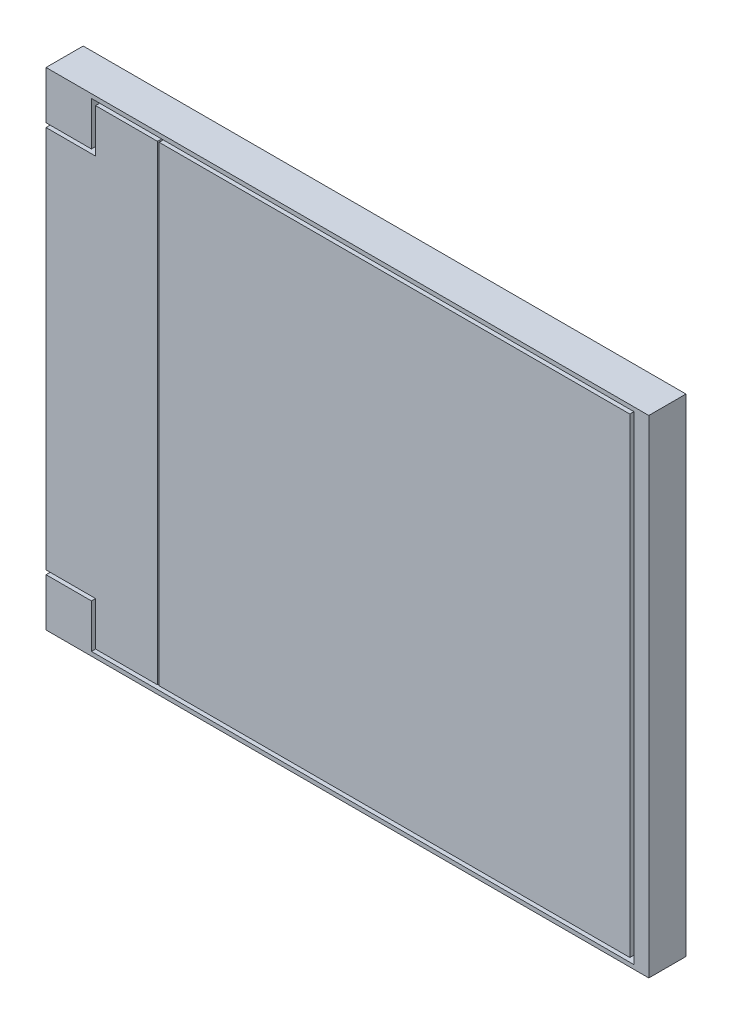
ISO-10303-21;
HEADER;
FILE_DESCRIPTION(('STEP AP214'),'2;1');
FILE_NAME('part.step','',(''),(''),'','','');
FILE_SCHEMA(('AUTOMOTIVE_DESIGN { 1 0 10303 214 1 1 1 1 }'));
ENDSEC;
DATA;
#1=APPLICATION_CONTEXT('core data for automotive mechanical design processes');
#2=APPLICATION_PROTOCOL_DEFINITION('international standard','automotive_design',2000,#1);
#3=PRODUCT_CONTEXT('',#1,'mechanical');
#4=PRODUCT('Part','Part','',(#3));
#5=PRODUCT_RELATED_PRODUCT_CATEGORY('part','',(#4));
#6=PRODUCT_DEFINITION_FORMATION('','',#4);
#7=PRODUCT_DEFINITION_CONTEXT('part definition',#1,'design');
#8=PRODUCT_DEFINITION('design','',#6,#7);
#9=PRODUCT_DEFINITION_SHAPE('','',#8);
#10=(LENGTH_UNIT() NAMED_UNIT(*) SI_UNIT(.MILLI.,.METRE.));
#11=(NAMED_UNIT(*) PLANE_ANGLE_UNIT() SI_UNIT($,.RADIAN.));
#12=(NAMED_UNIT(*) SI_UNIT($,.STERADIAN.) SOLID_ANGLE_UNIT());
#13=UNCERTAINTY_MEASURE_WITH_UNIT(LENGTH_MEASURE(1.E-05),#10,'distance_accuracy_value','');
#14=(GEOMETRIC_REPRESENTATION_CONTEXT(3) GLOBAL_UNCERTAINTY_ASSIGNED_CONTEXT((#13)) GLOBAL_UNIT_ASSIGNED_CONTEXT((#10,
#11,#12)) REPRESENTATION_CONTEXT('',''));
#15=CARTESIAN_POINT('',(0.,0.,0.));
#16=DIRECTION('',(0.,0.,1.));
#17=DIRECTION('',(1.,0.,0.));
#18=AXIS2_PLACEMENT_3D('',#15,#16,#17);
#19=CARTESIAN_POINT('',(35.6,0.,2.25));
#20=DIRECTION('',(-1.,0.,0.));
#21=DIRECTION('',(0.,0.,1.));
#22=AXIS2_PLACEMENT_3D('',#19,#20,#21);
#23=PLANE('',#22);
#24=DIRECTION('',(0.,1.,0.));
#25=VECTOR('',#24,1.);
#26=CARTESIAN_POINT('',(35.6,0.,0.1));
#27=LINE('',#26,#25);
#28=CARTESIAN_POINT('',(35.6,0.25,0.0999999999999998));
#29=VERTEX_POINT('',#28);
#30=CARTESIAN_POINT('',(35.6,29.25,0.0999999999999998));
#31=VERTEX_POINT('',#30);
#32=EDGE_CURVE('E477',#29,#31,#27,.T.);
#33=ORIENTED_EDGE('',*,*,#32,.F.);
#34=DIRECTION('',(0.,0.,-1.));
#35=VECTOR('',#34,1.);
#36=CARTESIAN_POINT('',(35.6,0.25,2.25));
#37=LINE('',#36,#35);
#38=CARTESIAN_POINT('',(35.6,0.25,2.25));
#39=VERTEX_POINT('',#38);
#40=EDGE_CURVE('E11',#39,#29,#37,.T.);
#41=ORIENTED_EDGE('',*,*,#40,.F.);
#42=DIRECTION('',(0.,1.,0.));
#43=VECTOR('',#42,1.);
#44=CARTESIAN_POINT('',(35.6,0.,2.25));
#45=LINE('',#44,#43);
#46=CARTESIAN_POINT('',(35.6,29.25,2.25));
#47=VERTEX_POINT('',#46);
#48=EDGE_CURVE('E499',#39,#47,#45,.T.);
#49=ORIENTED_EDGE('',*,*,#48,.T.);
#50=DIRECTION('',(0.,0.,-1.));
#51=VECTOR('',#50,1.);
#52=CARTESIAN_POINT('',(35.6,29.25,2.25));
#53=LINE('',#52,#51);
#54=EDGE_CURVE('E536',#47,#31,#53,.T.);
#55=ORIENTED_EDGE('',*,*,#54,.T.);
#56=EDGE_LOOP('',(#33,#41,#49,#55));
#57=FACE_BOUND('',#56,.T.);
#58=ADVANCED_FACE('F43',(#57),#23,.T.);
#59=CARTESIAN_POINT('',(0.,0.25,2.25));
#60=DIRECTION('',(0.,1.,0.));
#61=DIRECTION('',(0.,0.,1.));
#62=AXIS2_PLACEMENT_3D('',#59,#60,#61);
#63=PLANE('',#62);
#64=DIRECTION('',(1.,0.,0.));
#65=VECTOR('',#64,1.);
#66=CARTESIAN_POINT('',(0.,0.25,0.1));
#67=LINE('',#66,#65);
#68=CARTESIAN_POINT('',(2.75,0.25,0.0999999999999998));
#69=VERTEX_POINT('',#68);
#70=EDGE_CURVE('E473',#69,#29,#67,.T.);
#71=ORIENTED_EDGE('',*,*,#70,.F.);
#72=DIRECTION('',(0.,0.,-1.));
#73=VECTOR('',#72,1.);
#74=CARTESIAN_POINT('',(2.75,0.25,2.25));
#75=LINE('',#74,#73);
#76=CARTESIAN_POINT('',(2.75,0.25,2.25));
#77=VERTEX_POINT('',#76);
#78=EDGE_CURVE('E51',#77,#69,#75,.T.);
#79=ORIENTED_EDGE('',*,*,#78,.F.);
#80=DIRECTION('',(1.,0.,0.));
#81=VECTOR('',#80,1.);
#82=CARTESIAN_POINT('',(0.,0.25,2.25));
#83=LINE('',#82,#81);
#84=EDGE_CURVE('E503',#77,#39,#83,.T.);
#85=ORIENTED_EDGE('',*,*,#84,.T.);
#86=ORIENTED_EDGE('',*,*,#40,.T.);
#87=EDGE_LOOP('',(#71,#79,#85,#86));
#88=FACE_BOUND('',#87,.T.);
#89=ADVANCED_FACE('F614',(#88),#63,.T.);
#90=CARTESIAN_POINT('',(2.75,0.,2.25));
#91=DIRECTION('',(-1.,0.,0.));
#92=DIRECTION('',(0.,0.,1.));
#93=AXIS2_PLACEMENT_3D('',#90,#91,#92);
#94=PLANE('',#93);
#95=ORIENTED_EDGE('',*,*,#78,.T.);
#96=DIRECTION('',(0.,1.,0.));
#97=VECTOR('',#96,1.);
#98=CARTESIAN_POINT('',(2.75,0.,0.1));
#99=LINE('',#98,#97);
#100=CARTESIAN_POINT('',(2.75,2.9,0.0999999999999998));
#101=VERTEX_POINT('',#100);
#102=EDGE_CURVE('E488',#69,#101,#99,.T.);
#103=ORIENTED_EDGE('',*,*,#102,.T.);
#104=DIRECTION('',(0.,0.,-1.));
#105=VECTOR('',#104,1.);
#106=CARTESIAN_POINT('',(2.75,2.9,2.25));
#107=LINE('',#106,#105);
#108=CARTESIAN_POINT('',(2.75,2.9,2.25));
#109=VERTEX_POINT('',#108);
#110=EDGE_CURVE('E582',#109,#101,#107,.T.);
#111=ORIENTED_EDGE('',*,*,#110,.F.);
#112=DIRECTION('',(0.,1.,0.));
#113=VECTOR('',#112,1.);
#114=CARTESIAN_POINT('',(2.75,0.,2.25));
#115=LINE('',#114,#113);
#116=EDGE_CURVE('E508',#77,#109,#115,.T.);
#117=ORIENTED_EDGE('',*,*,#116,.F.);
#118=EDGE_LOOP('',(#95,#103,#111,#117));
#119=FACE_BOUND('',#118,.T.);
#120=ADVANCED_FACE('F590',(#119),#94,.F.);
#121=CARTESIAN_POINT('',(0.,2.9,2.25));
#122=DIRECTION('',(0.,1.,0.));
#123=DIRECTION('',(-1.,0.,0.));
#124=AXIS2_PLACEMENT_3D('',#121,#122,#123);
#125=PLANE('',#124);
#126=DIRECTION('',(1.,0.,0.));
#127=VECTOR('',#126,1.);
#128=CARTESIAN_POINT('',(0.,2.9,0.1));
#129=LINE('',#128,#127);
#130=CARTESIAN_POINT('',(0.,2.9,0.0999999999999998));
#131=VERTEX_POINT('',#130);
#132=EDGE_CURVE('E495',#131,#101,#129,.T.);
#133=ORIENTED_EDGE('',*,*,#132,.F.);
#134=DIRECTION('',(0.,0.,-1.));
#135=VECTOR('',#134,1.);
#136=CARTESIAN_POINT('',(0.,2.9,2.25));
#137=LINE('',#136,#135);
#138=CARTESIAN_POINT('',(0.,2.9,2.25));
#139=VERTEX_POINT('',#138);
#140=EDGE_CURVE('E578',#139,#131,#137,.T.);
#141=ORIENTED_EDGE('',*,*,#140,.F.);
#142=DIRECTION('',(1.,0.,0.));
#143=VECTOR('',#142,1.);
#144=CARTESIAN_POINT('',(0.,2.9,2.25));
#145=LINE('',#144,#143);
#146=EDGE_CURVE('E511',#139,#109,#145,.T.);
#147=ORIENTED_EDGE('',*,*,#146,.T.);
#148=ORIENTED_EDGE('',*,*,#110,.T.);
#149=EDGE_LOOP('',(#133,#141,#147,#148));
#150=FACE_BOUND('',#149,.T.);
#151=ADVANCED_FACE('F605',(#150),#125,.T.);
#152=CARTESIAN_POINT('',(0.,0.,2.25));
#153=DIRECTION('',(0.,1.,0.));
#154=DIRECTION('',(0.,0.,1.));
#155=AXIS2_PLACEMENT_3D('',#152,#153,#154);
#156=PLANE('',#155);
#157=DIRECTION('',(1.,0.,0.));
#158=VECTOR('',#157,1.);
#159=CARTESIAN_POINT('',(0.,0.,0.));
#160=LINE('',#159,#158);
#161=CARTESIAN_POINT('',(0.,0.,0.));
#162=VERTEX_POINT('',#161);
#163=CARTESIAN_POINT('',(36.5,0.,0.));
#164=VERTEX_POINT('',#163);
#165=EDGE_CURVE('E540',#162,#164,#160,.T.);
#166=ORIENTED_EDGE('',*,*,#165,.T.);
#167=DIRECTION('',(0.,0.,-1.));
#168=VECTOR('',#167,1.);
#169=CARTESIAN_POINT('',(36.5,0.,2.25));
#170=LINE('',#169,#168);
#171=CARTESIAN_POINT('',(36.5,0.,2.25));
#172=VERTEX_POINT('',#171);
#173=EDGE_CURVE('E570',#172,#164,#170,.T.);
#174=ORIENTED_EDGE('',*,*,#173,.F.);
#175=DIRECTION('',(1.,0.,0.));
#176=VECTOR('',#175,1.);
#177=CARTESIAN_POINT('',(0.,0.,2.25));
#178=LINE('',#177,#176);
#179=CARTESIAN_POINT('',(0.,0.,2.25));
#180=VERTEX_POINT('',#179);
#181=EDGE_CURVE('E519',#180,#172,#178,.T.);
#182=ORIENTED_EDGE('',*,*,#181,.F.);
#183=DIRECTION('',(0.,0.,-1.));
#184=VECTOR('',#183,1.);
#185=CARTESIAN_POINT('',(0.,0.,2.25));
#186=LINE('',#185,#184);
#187=EDGE_CURVE('E574',#180,#162,#186,.T.);
#188=ORIENTED_EDGE('',*,*,#187,.T.);
#189=EDGE_LOOP('',(#166,#174,#182,#188));
#190=FACE_BOUND('',#189,.T.);
#191=ADVANCED_FACE('F685',(#190),#156,.F.);
#192=CARTESIAN_POINT('',(36.5,0.,2.25));
#193=DIRECTION('',(-1.,0.,0.));
#194=DIRECTION('',(0.,0.,1.));
#195=AXIS2_PLACEMENT_3D('',#192,#193,#194);
#196=PLANE('',#195);
#197=DIRECTION('',(0.,1.,0.));
#198=VECTOR('',#197,1.);
#199=CARTESIAN_POINT('',(36.5,0.,0.));
#200=LINE('',#199,#198);
#201=CARTESIAN_POINT('',(36.5,29.5,0.));
#202=VERTEX_POINT('',#201);
#203=EDGE_CURVE('E543',#164,#202,#200,.T.);
#204=ORIENTED_EDGE('',*,*,#203,.T.);
#205=DIRECTION('',(0.,0.,-1.));
#206=VECTOR('',#205,1.);
#207=CARTESIAN_POINT('',(36.5,29.5,2.25));
#208=LINE('',#207,#206);
#209=CARTESIAN_POINT('',(36.5,29.5,2.25));
#210=VERTEX_POINT('',#209);
#211=EDGE_CURVE('E567',#210,#202,#208,.T.);
#212=ORIENTED_EDGE('',*,*,#211,.F.);
#213=DIRECTION('',(0.,1.,0.));
#214=VECTOR('',#213,1.);
#215=CARTESIAN_POINT('',(36.5,0.,2.25));
#216=LINE('',#215,#214);
#217=EDGE_CURVE('E523',#172,#210,#216,.T.);
#218=ORIENTED_EDGE('',*,*,#217,.F.);
#219=ORIENTED_EDGE('',*,*,#173,.T.);
#220=EDGE_LOOP('',(#204,#212,#218,#219));
#221=FACE_BOUND('',#220,.T.);
#222=ADVANCED_FACE('F688',(#221),#196,.F.);
#223=CARTESIAN_POINT('',(0.,29.5,2.25));
#224=DIRECTION('',(0.,1.,0.));
#225=DIRECTION('',(0.,0.,1.));
#226=AXIS2_PLACEMENT_3D('',#223,#224,#225);
#227=PLANE('',#226);
#228=DIRECTION('',(1.,0.,0.));
#229=VECTOR('',#228,1.);
#230=CARTESIAN_POINT('',(0.,29.5,0.));
#231=LINE('',#230,#229);
#232=CARTESIAN_POINT('',(0.,29.5,0.));
#233=VERTEX_POINT('',#232);
#234=EDGE_CURVE('E539',#233,#202,#231,.T.);
#235=ORIENTED_EDGE('',*,*,#234,.F.);
#236=DIRECTION('',(0.,0.,-1.));
#237=VECTOR('',#236,1.);
#238=CARTESIAN_POINT('',(0.,29.5,2.25));
#239=LINE('',#238,#237);
#240=CARTESIAN_POINT('',(0.,29.5,2.25));
#241=VERTEX_POINT('',#240);
#242=EDGE_CURVE('E564',#241,#233,#239,.T.);
#243=ORIENTED_EDGE('',*,*,#242,.F.);
#244=DIRECTION('',(1.,0.,0.));
#245=VECTOR('',#244,1.);
#246=CARTESIAN_POINT('',(0.,29.5,2.25));
#247=LINE('',#246,#245);
#248=EDGE_CURVE('E526',#241,#210,#247,.T.);
#249=ORIENTED_EDGE('',*,*,#248,.T.);
#250=ORIENTED_EDGE('',*,*,#211,.T.);
#251=EDGE_LOOP('',(#235,#243,#249,#250));
#252=FACE_BOUND('',#251,.T.);
#253=ADVANCED_FACE('F692',(#252),#227,.T.);
#254=CARTESIAN_POINT('',(0.,0.,2.25));
#255=DIRECTION('',(1.,0.,0.));
#256=DIRECTION('',(0.,0.,-1.));
#257=AXIS2_PLACEMENT_3D('',#254,#255,#256);
#258=PLANE('',#257);
#259=DIRECTION('',(0.,-1.,0.));
#260=VECTOR('',#259,1.);
#261=CARTESIAN_POINT('',(0.,0.,0.));
#262=LINE('',#261,#260);
#263=EDGE_CURVE('E504',#233,#162,#262,.T.);
#264=ORIENTED_EDGE('',*,*,#263,.T.);
#265=ORIENTED_EDGE('',*,*,#187,.F.);
#266=DIRECTION('',(0.,-1.,0.));
#267=VECTOR('',#266,1.);
#268=CARTESIAN_POINT('',(0.,0.,2.25));
#269=LINE('',#268,#267);
#270=EDGE_CURVE('E516',#139,#180,#269,.T.);
#271=ORIENTED_EDGE('',*,*,#270,.F.);
#272=ORIENTED_EDGE('',*,*,#140,.T.);
#273=DIRECTION('',(0.,-1.,0.));
#274=VECTOR('',#273,1.);
#275=CARTESIAN_POINT('',(0.,0.,0.1));
#276=LINE('',#275,#274);
#277=CARTESIAN_POINT('',(0.,3.15,0.1));
#278=VERTEX_POINT('',#277);
#279=EDGE_CURVE('E491',#278,#131,#276,.T.);
#280=ORIENTED_EDGE('',*,*,#279,.F.);
#281=DIRECTION('',(0.,0.,-1.));
#282=VECTOR('',#281,1.);
#283=CARTESIAN_POINT('',(0.,3.15,42.5550865276332));
#284=LINE('',#283,#282);
#285=CARTESIAN_POINT('',(0.,3.15,2.25));
#286=VERTEX_POINT('',#285);
#287=EDGE_CURVE('E388',#286,#278,#284,.T.);
#288=ORIENTED_EDGE('',*,*,#287,.F.);
#289=DIRECTION('',(0.,-1.,0.));
#290=VECTOR('',#289,1.);
#291=CARTESIAN_POINT('',(0.,0.,2.25));
#292=LINE('',#291,#290);
#293=CARTESIAN_POINT('',(0.,26.35,2.25));
#294=VERTEX_POINT('',#293);
#295=EDGE_CURVE('E345',#294,#286,#292,.T.);
#296=ORIENTED_EDGE('',*,*,#295,.F.);
#297=DIRECTION('',(0.,0.,-1.));
#298=VECTOR('',#297,1.);
#299=CARTESIAN_POINT('',(0.,26.35,42.5550865276332));
#300=LINE('',#299,#298);
#301=CARTESIAN_POINT('',(0.,26.35,0.1));
#302=VERTEX_POINT('',#301);
#303=EDGE_CURVE('E381',#294,#302,#300,.T.);
#304=ORIENTED_EDGE('',*,*,#303,.T.);
#305=CARTESIAN_POINT('',(0.,26.6,0.0999999999999998));
#306=VERTEX_POINT('',#305);
#307=EDGE_CURVE('E492',#306,#302,#276,.T.);
#308=ORIENTED_EDGE('',*,*,#307,.F.);
#309=DIRECTION('',(0.,0.,-1.));
#310=VECTOR('',#309,1.);
#311=CARTESIAN_POINT('',(0.,26.6,2.25));
#312=LINE('',#311,#310);
#313=CARTESIAN_POINT('',(0.,26.6,2.25));
#314=VERTEX_POINT('',#313);
#315=EDGE_CURVE('E561',#314,#306,#312,.T.);
#316=ORIENTED_EDGE('',*,*,#315,.F.);
#317=EDGE_CURVE('E520',#241,#314,#269,.T.);
#318=ORIENTED_EDGE('',*,*,#317,.F.);
#319=ORIENTED_EDGE('',*,*,#242,.T.);
#320=EDGE_LOOP('',(#264,#265,#271,#272,#280,#288,#296,#304,#308,#316,#318,#319));
#321=FACE_BOUND('',#320,.T.);
#322=ADVANCED_FACE('F607',(#321),#258,.F.);
#323=CARTESIAN_POINT('',(0.,26.6,2.25));
#324=DIRECTION('',(0.,1.,0.));
#325=DIRECTION('',(-1.,0.,0.));
#326=AXIS2_PLACEMENT_3D('',#323,#324,#325);
#327=PLANE('',#326);
#328=ORIENTED_EDGE('',*,*,#315,.T.);
#329=DIRECTION('',(1.,0.,0.));
#330=VECTOR('',#329,1.);
#331=CARTESIAN_POINT('',(0.,26.6,0.1));
#332=LINE('',#331,#330);
#333=CARTESIAN_POINT('',(2.75,26.6,0.0999999999999998));
#334=VERTEX_POINT('',#333);
#335=EDGE_CURVE('E487',#306,#334,#332,.T.);
#336=ORIENTED_EDGE('',*,*,#335,.T.);
#337=DIRECTION('',(0.,0.,-1.));
#338=VECTOR('',#337,1.);
#339=CARTESIAN_POINT('',(2.75,26.6,2.25));
#340=LINE('',#339,#338);
#341=CARTESIAN_POINT('',(2.75,26.6,2.25));
#342=VERTEX_POINT('',#341);
#343=EDGE_CURVE('E557',#342,#334,#340,.T.);
#344=ORIENTED_EDGE('',*,*,#343,.F.);
#345=DIRECTION('',(1.,0.,0.));
#346=VECTOR('',#345,1.);
#347=CARTESIAN_POINT('',(0.,26.6,2.25));
#348=LINE('',#347,#346);
#349=EDGE_CURVE('E530',#314,#342,#348,.T.);
#350=ORIENTED_EDGE('',*,*,#349,.F.);
#351=EDGE_LOOP('',(#328,#336,#344,#350));
#352=FACE_BOUND('',#351,.T.);
#353=ADVANCED_FACE('F630',(#352),#327,.F.);
#354=ORIENTED_EDGE('',*,*,#343,.T.);
#355=CARTESIAN_POINT('',(2.75,29.25,0.0999999999999998));
#356=VERTEX_POINT('',#355);
#357=EDGE_CURVE('E484',#334,#356,#99,.T.);
#358=ORIENTED_EDGE('',*,*,#357,.T.);
#359=DIRECTION('',(0.,0.,-1.));
#360=VECTOR('',#359,1.);
#361=CARTESIAN_POINT('',(2.75,29.25,2.25));
#362=LINE('',#361,#360);
#363=CARTESIAN_POINT('',(2.75,29.25,2.25));
#364=VERTEX_POINT('',#363);
#365=EDGE_CURVE('E553',#364,#356,#362,.T.);
#366=ORIENTED_EDGE('',*,*,#365,.F.);
#367=EDGE_CURVE('E512',#342,#364,#115,.T.);
#368=ORIENTED_EDGE('',*,*,#367,.F.);
#369=EDGE_LOOP('',(#354,#358,#366,#368));
#370=FACE_BOUND('',#369,.T.);
#371=ADVANCED_FACE('F626',(#370),#94,.F.);
#372=CARTESIAN_POINT('',(0.,29.25,2.25));
#373=DIRECTION('',(0.,1.,0.));
#374=DIRECTION('',(0.,0.,1.));
#375=AXIS2_PLACEMENT_3D('',#372,#373,#374);
#376=PLANE('',#375);
#377=ORIENTED_EDGE('',*,*,#365,.T.);
#378=DIRECTION('',(1.,0.,0.));
#379=VECTOR('',#378,1.);
#380=CARTESIAN_POINT('',(0.,29.25,0.1));
#381=LINE('',#380,#379);
#382=EDGE_CURVE('E481',#356,#31,#381,.T.);
#383=ORIENTED_EDGE('',*,*,#382,.T.);
#384=ORIENTED_EDGE('',*,*,#54,.F.);
#385=DIRECTION('',(1.,0.,0.));
#386=VECTOR('',#385,1.);
#387=CARTESIAN_POINT('',(0.,29.25,2.25));
#388=LINE('',#387,#386);
#389=EDGE_CURVE('E533',#364,#47,#388,.T.);
#390=ORIENTED_EDGE('',*,*,#389,.F.);
#391=EDGE_LOOP('',(#377,#383,#384,#390));
#392=FACE_BOUND('',#391,.T.);
#393=ADVANCED_FACE('F621',(#392),#376,.F.);
#394=CARTESIAN_POINT('',(0.,0.,2.25));
#395=DIRECTION('',(0.,0.,1.));
#396=DIRECTION('',(1.,0.,0.));
#397=AXIS2_PLACEMENT_3D('',#394,#395,#396);
#398=PLANE('',#397);
#399=ORIENTED_EDGE('',*,*,#48,.F.);
#400=ORIENTED_EDGE('',*,*,#84,.F.);
#401=ORIENTED_EDGE('',*,*,#116,.T.);
#402=ORIENTED_EDGE('',*,*,#146,.F.);
#403=ORIENTED_EDGE('',*,*,#270,.T.);
#404=ORIENTED_EDGE('',*,*,#181,.T.);
#405=ORIENTED_EDGE('',*,*,#217,.T.);
#406=ORIENTED_EDGE('',*,*,#248,.F.);
#407=ORIENTED_EDGE('',*,*,#317,.T.);
#408=ORIENTED_EDGE('',*,*,#349,.T.);
#409=ORIENTED_EDGE('',*,*,#367,.T.);
#410=ORIENTED_EDGE('',*,*,#389,.T.);
#411=EDGE_LOOP('',(#399,#400,#401,#402,#403,#404,#405,#406,#407,#408,#409,#410));
#412=FACE_BOUND('',#411,.T.);
#413=ADVANCED_FACE('F613',(#412),#398,.T.);
#414=CARTESIAN_POINT('',(0.,0.,0.));
#415=DIRECTION('',(0.,0.,1.));
#416=DIRECTION('',(1.,0.,0.));
#417=AXIS2_PLACEMENT_3D('',#414,#415,#416);
#418=PLANE('',#417);
#419=DIRECTION('',(1.,0.,0.));
#420=VECTOR('',#419,1.);
#421=CARTESIAN_POINT('',(0.,20.15,0.));
#422=LINE('',#421,#420);
#423=CARTESIAN_POINT('',(7.3,20.15,0.));
#424=VERTEX_POINT('',#423);
#425=CARTESIAN_POINT('',(8.8,20.15,0.));
#426=VERTEX_POINT('',#425);
#427=EDGE_CURVE('E295',#424,#426,#422,.T.);
#428=ORIENTED_EDGE('',*,*,#427,.F.);
#429=DIRECTION('',(0.,-1.,0.));
#430=VECTOR('',#429,1.);
#431=CARTESIAN_POINT('',(7.3,0.,0.));
#432=LINE('',#431,#430);
#433=CARTESIAN_POINT('',(7.3,19.75,0.));
#434=VERTEX_POINT('',#433);
#435=EDGE_CURVE('E261',#424,#434,#432,.T.);
#436=ORIENTED_EDGE('',*,*,#435,.T.);
#437=DIRECTION('',(1.,0.,0.));
#438=VECTOR('',#437,1.);
#439=CARTESIAN_POINT('',(0.,19.75,0.));
#440=LINE('',#439,#438);
#441=CARTESIAN_POINT('',(8.8,19.75,0.));
#442=VERTEX_POINT('',#441);
#443=EDGE_CURVE('E282',#434,#442,#440,.T.);
#444=ORIENTED_EDGE('',*,*,#443,.T.);
#445=DIRECTION('',(0.,1.,0.));
#446=VECTOR('',#445,1.);
#447=CARTESIAN_POINT('',(8.8,0.,0.));
#448=LINE('',#447,#446);
#449=EDGE_CURVE('E58',#442,#426,#448,.T.);
#450=ORIENTED_EDGE('',*,*,#449,.T.);
#451=EDGE_LOOP('',(#428,#436,#444,#450));
#452=FACE_BOUND('',#451,.T.);
#453=DIRECTION('',(0.,1.,0.));
#454=VECTOR('',#453,1.);
#455=CARTESIAN_POINT('',(7.3,0.,0.));
#456=LINE('',#455,#454);
#457=CARTESIAN_POINT('',(7.3,9.35,0.));
#458=VERTEX_POINT('',#457);
#459=CARTESIAN_POINT('',(7.3,9.75,0.));
#460=VERTEX_POINT('',#459);
#461=EDGE_CURVE('E326',#458,#460,#456,.T.);
#462=ORIENTED_EDGE('',*,*,#461,.F.);
#463=DIRECTION('',(1.,0.,0.));
#464=VECTOR('',#463,1.);
#465=CARTESIAN_POINT('',(0.,9.35,0.));
#466=LINE('',#465,#464);
#467=CARTESIAN_POINT('',(8.8,9.35,0.));
#468=VERTEX_POINT('',#467);
#469=EDGE_CURVE('E266',#458,#468,#466,.T.);
#470=ORIENTED_EDGE('',*,*,#469,.T.);
#471=DIRECTION('',(0.,1.,0.));
#472=VECTOR('',#471,1.);
#473=CARTESIAN_POINT('',(8.8,0.,0.));
#474=LINE('',#473,#472);
#475=CARTESIAN_POINT('',(8.8,9.75,0.));
#476=VERTEX_POINT('',#475);
#477=EDGE_CURVE('E312',#468,#476,#474,.T.);
#478=ORIENTED_EDGE('',*,*,#477,.T.);
#479=DIRECTION('',(1.,0.,0.));
#480=VECTOR('',#479,1.);
#481=CARTESIAN_POINT('',(0.,9.75,0.));
#482=LINE('',#481,#480);
#483=EDGE_CURVE('E66',#460,#476,#482,.T.);
#484=ORIENTED_EDGE('',*,*,#483,.F.);
#485=EDGE_LOOP('',(#462,#470,#478,#484));
#486=FACE_BOUND('',#485,.T.);
#487=ORIENTED_EDGE('',*,*,#165,.F.);
#488=ORIENTED_EDGE('',*,*,#263,.F.);
#489=ORIENTED_EDGE('',*,*,#234,.T.);
#490=ORIENTED_EDGE('',*,*,#203,.F.);
#491=EDGE_LOOP('',(#487,#488,#489,#490));
#492=FACE_BOUND('',#491,.T.);
#493=ADVANCED_FACE('F704',(#452,#486,#492),#418,.F.);
#494=CARTESIAN_POINT('',(0.,0.,0.1));
#495=DIRECTION('',(0.,0.,1.));
#496=DIRECTION('',(1.,0.,0.));
#497=AXIS2_PLACEMENT_3D('',#494,#495,#496);
#498=PLANE('',#497);
#499=DIRECTION('',(-1.,0.,0.));
#500=VECTOR('',#499,1.);
#501=CARTESIAN_POINT('',(0.,3.15,0.1));
#502=LINE('',#501,#500);
#503=CARTESIAN_POINT('',(3.,3.15,0.1));
#504=VERTEX_POINT('',#503);
#505=EDGE_CURVE('E365',#504,#278,#502,.T.);
#506=ORIENTED_EDGE('',*,*,#505,.T.);
#507=ORIENTED_EDGE('',*,*,#279,.T.);
#508=ORIENTED_EDGE('',*,*,#132,.T.);
#509=ORIENTED_EDGE('',*,*,#102,.F.);
#510=ORIENTED_EDGE('',*,*,#70,.T.);
#511=ORIENTED_EDGE('',*,*,#32,.T.);
#512=ORIENTED_EDGE('',*,*,#382,.F.);
#513=ORIENTED_EDGE('',*,*,#357,.F.);
#514=ORIENTED_EDGE('',*,*,#335,.F.);
#515=ORIENTED_EDGE('',*,*,#307,.T.);
#516=DIRECTION('',(1.,0.,0.));
#517=VECTOR('',#516,1.);
#518=CARTESIAN_POINT('',(0.,26.35,0.1));
#519=LINE('',#518,#517);
#520=CARTESIAN_POINT('',(3.,26.35,0.1));
#521=VERTEX_POINT('',#520);
#522=EDGE_CURVE('E350',#302,#521,#519,.T.);
#523=ORIENTED_EDGE('',*,*,#522,.T.);
#524=DIRECTION('',(0.,1.,0.));
#525=VECTOR('',#524,1.);
#526=CARTESIAN_POINT('',(3.,0.,0.1));
#527=LINE('',#526,#525);
#528=CARTESIAN_POINT('',(3.,29.,0.1));
#529=VERTEX_POINT('',#528);
#530=EDGE_CURVE('E346',#521,#529,#527,.T.);
#531=ORIENTED_EDGE('',*,*,#530,.T.);
#532=DIRECTION('',(1.,0.,0.));
#533=VECTOR('',#532,1.);
#534=CARTESIAN_POINT('',(0.,29.,0.1));
#535=LINE('',#534,#533);
#536=CARTESIAN_POINT('',(6.74999999999998,29.,0.1));
#537=VERTEX_POINT('',#536);
#538=EDGE_CURVE('E349',#529,#537,#535,.T.);
#539=ORIENTED_EDGE('',*,*,#538,.T.);
#540=DIRECTION('',(0.,-1.,0.));
#541=VECTOR('',#540,1.);
#542=CARTESIAN_POINT('',(6.74999999999998,0.,0.1));
#543=LINE('',#542,#541);
#544=CARTESIAN_POINT('',(6.74999999999998,0.49999999999999,0.1));
#545=VERTEX_POINT('',#544);
#546=EDGE_CURVE('E353',#537,#545,#543,.T.);
#547=ORIENTED_EDGE('',*,*,#546,.T.);
#548=DIRECTION('',(1.,0.,0.));
#549=VECTOR('',#548,1.);
#550=CARTESIAN_POINT('',(0.,0.49999999999999,0.1));
#551=LINE('',#550,#549);
#552=CARTESIAN_POINT('',(3.,0.49999999999999,0.1));
#553=VERTEX_POINT('',#552);
#554=EDGE_CURVE('E357',#553,#545,#551,.T.);
#555=ORIENTED_EDGE('',*,*,#554,.F.);
#556=DIRECTION('',(0.,1.,0.));
#557=VECTOR('',#556,1.);
#558=CARTESIAN_POINT('',(3.,0.,0.1));
#559=LINE('',#558,#557);
#560=EDGE_CURVE('E356',#553,#504,#559,.T.);
#561=ORIENTED_EDGE('',*,*,#560,.T.);
#562=EDGE_LOOP('',(#506,#507,#508,#509,#510,#511,#512,#513,#514,#515,#523,#531,#539,#547,#555,#561));
#563=FACE_BOUND('',#562,.T.);
#564=DIRECTION('',(0.,-1.,0.));
#565=VECTOR('',#564,1.);
#566=CARTESIAN_POINT('',(35.35,0.,0.1));
#567=LINE('',#566,#565);
#568=CARTESIAN_POINT('',(35.35,29.,0.1));
#569=VERTEX_POINT('',#568);
#570=CARTESIAN_POINT('',(35.35,0.499999999999994,0.1));
#571=VERTEX_POINT('',#570);
#572=EDGE_CURVE('E430',#569,#571,#567,.T.);
#573=ORIENTED_EDGE('',*,*,#572,.T.);
#574=DIRECTION('',(-1.,0.,0.));
#575=VECTOR('',#574,1.);
#576=CARTESIAN_POINT('',(0.,0.499999999999989,0.1));
#577=LINE('',#576,#575);
#578=CARTESIAN_POINT('',(6.84999999999998,0.49999999999999,0.1));
#579=VERTEX_POINT('',#578);
#580=EDGE_CURVE('E433',#571,#579,#577,.T.);
#581=ORIENTED_EDGE('',*,*,#580,.T.);
#582=DIRECTION('',(0.,1.,0.));
#583=VECTOR('',#582,1.);
#584=CARTESIAN_POINT('',(6.84999999999998,0.,0.1));
#585=LINE('',#584,#583);
#586=CARTESIAN_POINT('',(6.84999999999998,29.,0.1));
#587=VERTEX_POINT('',#586);
#588=EDGE_CURVE('E436',#579,#587,#585,.T.);
#589=ORIENTED_EDGE('',*,*,#588,.T.);
#590=DIRECTION('',(1.,0.,0.));
#591=VECTOR('',#590,1.);
#592=CARTESIAN_POINT('',(0.,29.,0.1));
#593=LINE('',#592,#591);
#594=EDGE_CURVE('E429',#587,#569,#593,.T.);
#595=ORIENTED_EDGE('',*,*,#594,.T.);
#596=EDGE_LOOP('',(#573,#581,#589,#595));
#597=FACE_BOUND('',#596,.T.);
#598=ADVANCED_FACE('F595',(#563,#597),#498,.T.);
#599=CARTESIAN_POINT('',(0.,0.,2.25));
#600=DIRECTION('',(0.,0.,1.));
#601=DIRECTION('',(1.,0.,0.));
#602=AXIS2_PLACEMENT_3D('',#599,#600,#601);
#603=PLANE('',#602);
#604=DIRECTION('',(1.,0.,0.));
#605=VECTOR('',#604,1.);
#606=CARTESIAN_POINT('',(0.,29.,2.25));
#607=LINE('',#606,#605);
#608=CARTESIAN_POINT('',(6.84999999999998,29.,2.25));
#609=VERTEX_POINT('',#608);
#610=CARTESIAN_POINT('',(35.35,29.,2.25));
#611=VERTEX_POINT('',#610);
#612=EDGE_CURVE('E446',#609,#611,#607,.T.);
#613=ORIENTED_EDGE('',*,*,#612,.F.);
#614=DIRECTION('',(0.,1.,0.));
#615=VECTOR('',#614,1.);
#616=CARTESIAN_POINT('',(6.84999999999998,0.,2.25));
#617=LINE('',#616,#615);
#618=CARTESIAN_POINT('',(6.84999999999998,0.49999999999999,2.25));
#619=VERTEX_POINT('',#618);
#620=EDGE_CURVE('E452',#619,#609,#617,.T.);
#621=ORIENTED_EDGE('',*,*,#620,.F.);
#622=DIRECTION('',(-1.,0.,0.));
#623=VECTOR('',#622,1.);
#624=CARTESIAN_POINT('',(0.,0.499999999999989,2.25));
#625=LINE('',#624,#623);
#626=CARTESIAN_POINT('',(35.35,0.499999999999994,2.25));
#627=VERTEX_POINT('',#626);
#628=EDGE_CURVE('E457',#627,#619,#625,.T.);
#629=ORIENTED_EDGE('',*,*,#628,.F.);
#630=DIRECTION('',(0.,-1.,0.));
#631=VECTOR('',#630,1.);
#632=CARTESIAN_POINT('',(35.35,0.,2.25));
#633=LINE('',#632,#631);
#634=EDGE_CURVE('E439',#611,#627,#633,.T.);
#635=ORIENTED_EDGE('',*,*,#634,.F.);
#636=EDGE_LOOP('',(#613,#621,#629,#635));
#637=FACE_BOUND('',#636,.T.);
#638=ADVANCED_FACE('F712',(#637),#603,.T.);
#639=CARTESIAN_POINT('',(35.35,0.,42.5550865276332));
#640=DIRECTION('',(1.,0.,0.));
#641=DIRECTION('',(0.,1.,0.));
#642=AXIS2_PLACEMENT_3D('',#639,#640,#641);
#643=PLANE('',#642);
#644=DIRECTION('',(0.,0.,-1.));
#645=VECTOR('',#644,1.);
#646=CARTESIAN_POINT('',(35.35,29.,42.5550865276332));
#647=LINE('',#646,#645);
#648=EDGE_CURVE('E450',#611,#569,#647,.T.);
#649=ORIENTED_EDGE('',*,*,#648,.F.);
#650=ORIENTED_EDGE('',*,*,#634,.T.);
#651=DIRECTION('',(0.,0.,-1.));
#652=VECTOR('',#651,1.);
#653=CARTESIAN_POINT('',(35.35,0.499999999999994,42.5550865276332));
#654=LINE('',#653,#652);
#655=EDGE_CURVE('E445',#627,#571,#654,.T.);
#656=ORIENTED_EDGE('',*,*,#655,.T.);
#657=ORIENTED_EDGE('',*,*,#572,.F.);
#658=EDGE_LOOP('',(#649,#650,#656,#657));
#659=FACE_BOUND('',#658,.T.);
#660=ADVANCED_FACE('F715',(#659),#643,.T.);
#661=CARTESIAN_POINT('',(0.,0.499999999999989,42.5550865276332));
#662=DIRECTION('',(0.,-1.,0.));
#663=DIRECTION('',(1.,0.,0.));
#664=AXIS2_PLACEMENT_3D('',#661,#662,#663);
#665=PLANE('',#664);
#666=ORIENTED_EDGE('',*,*,#655,.F.);
#667=ORIENTED_EDGE('',*,*,#628,.T.);
#668=DIRECTION('',(0.,0.,-1.));
#669=VECTOR('',#668,1.);
#670=CARTESIAN_POINT('',(6.84999999999998,0.49999999999999,42.5550865276332));
#671=LINE('',#670,#669);
#672=EDGE_CURVE('E456',#619,#579,#671,.T.);
#673=ORIENTED_EDGE('',*,*,#672,.T.);
#674=ORIENTED_EDGE('',*,*,#580,.F.);
#675=EDGE_LOOP('',(#666,#667,#673,#674));
#676=FACE_BOUND('',#675,.T.);
#677=ADVANCED_FACE('F719',(#676),#665,.T.);
#678=CARTESIAN_POINT('',(6.84999999999998,0.,42.5550865276332));
#679=DIRECTION('',(-1.,0.,0.));
#680=DIRECTION('',(0.,0.,1.));
#681=AXIS2_PLACEMENT_3D('',#678,#679,#680);
#682=PLANE('',#681);
#683=ORIENTED_EDGE('',*,*,#672,.F.);
#684=ORIENTED_EDGE('',*,*,#620,.T.);
#685=DIRECTION('',(0.,0.,-1.));
#686=VECTOR('',#685,1.);
#687=CARTESIAN_POINT('',(6.84999999999998,29.,42.5550865276332));
#688=LINE('',#687,#686);
#689=EDGE_CURVE('E451',#609,#587,#688,.T.);
#690=ORIENTED_EDGE('',*,*,#689,.T.);
#691=ORIENTED_EDGE('',*,*,#588,.F.);
#692=EDGE_LOOP('',(#683,#684,#690,#691));
#693=FACE_BOUND('',#692,.T.);
#694=ADVANCED_FACE('F671',(#693),#682,.T.);
#695=CARTESIAN_POINT('',(0.,29.,42.5550865276332));
#696=DIRECTION('',(0.,1.,0.));
#697=DIRECTION('',(0.,0.,1.));
#698=AXIS2_PLACEMENT_3D('',#695,#696,#697);
#699=PLANE('',#698);
#700=ORIENTED_EDGE('',*,*,#689,.F.);
#701=ORIENTED_EDGE('',*,*,#612,.T.);
#702=ORIENTED_EDGE('',*,*,#648,.T.);
#703=ORIENTED_EDGE('',*,*,#594,.F.);
#704=EDGE_LOOP('',(#700,#701,#702,#703));
#705=FACE_BOUND('',#704,.T.);
#706=ADVANCED_FACE('F664',(#705),#699,.T.);
#707=CARTESIAN_POINT('',(0.,0.,2.25));
#708=DIRECTION('',(0.,0.,1.));
#709=DIRECTION('',(1.,0.,0.));
#710=AXIS2_PLACEMENT_3D('',#707,#708,#709);
#711=PLANE('',#710);
#712=DIRECTION('',(1.,0.,0.));
#713=VECTOR('',#712,1.);
#714=CARTESIAN_POINT('',(0.,26.35,2.25));
#715=LINE('',#714,#713);
#716=CARTESIAN_POINT('',(3.,26.35,2.25));
#717=VERTEX_POINT('',#716);
#718=EDGE_CURVE('E376',#294,#717,#715,.T.);
#719=ORIENTED_EDGE('',*,*,#718,.F.);
#720=ORIENTED_EDGE('',*,*,#295,.T.);
#721=DIRECTION('',(-1.,0.,0.));
#722=VECTOR('',#721,1.);
#723=CARTESIAN_POINT('',(0.,3.15,2.25));
#724=LINE('',#723,#722);
#725=CARTESIAN_POINT('',(3.,3.15,2.25));
#726=VERTEX_POINT('',#725);
#727=EDGE_CURVE('E384',#726,#286,#724,.T.);
#728=ORIENTED_EDGE('',*,*,#727,.F.);
#729=DIRECTION('',(0.,1.,0.));
#730=VECTOR('',#729,1.);
#731=CARTESIAN_POINT('',(3.,0.,2.25));
#732=LINE('',#731,#730);
#733=CARTESIAN_POINT('',(3.,0.49999999999999,2.25));
#734=VERTEX_POINT('',#733);
#735=EDGE_CURVE('E361',#734,#726,#732,.T.);
#736=ORIENTED_EDGE('',*,*,#735,.F.);
#737=DIRECTION('',(1.,0.,0.));
#738=VECTOR('',#737,1.);
#739=CARTESIAN_POINT('',(0.,0.49999999999999,2.25));
#740=LINE('',#739,#738);
#741=CARTESIAN_POINT('',(6.74999999999998,0.49999999999999,2.25));
#742=VERTEX_POINT('',#741);
#743=EDGE_CURVE('E371',#734,#742,#740,.T.);
#744=ORIENTED_EDGE('',*,*,#743,.T.);
#745=DIRECTION('',(0.,-1.,0.));
#746=VECTOR('',#745,1.);
#747=CARTESIAN_POINT('',(6.74999999999998,0.,2.25));
#748=LINE('',#747,#746);
#749=CARTESIAN_POINT('',(6.74999999999998,29.,2.25));
#750=VERTEX_POINT('',#749);
#751=EDGE_CURVE('E395',#750,#742,#748,.T.);
#752=ORIENTED_EDGE('',*,*,#751,.F.);
#753=DIRECTION('',(1.,0.,0.));
#754=VECTOR('',#753,1.);
#755=CARTESIAN_POINT('',(0.,29.,2.25));
#756=LINE('',#755,#754);
#757=CARTESIAN_POINT('',(3.,29.,2.25));
#758=VERTEX_POINT('',#757);
#759=EDGE_CURVE('E401',#758,#750,#756,.T.);
#760=ORIENTED_EDGE('',*,*,#759,.F.);
#761=DIRECTION('',(0.,1.,0.));
#762=VECTOR('',#761,1.);
#763=CARTESIAN_POINT('',(3.,0.,2.25));
#764=LINE('',#763,#762);
#765=EDGE_CURVE('E368',#717,#758,#764,.T.);
#766=ORIENTED_EDGE('',*,*,#765,.F.);
#767=EDGE_LOOP('',(#719,#720,#728,#736,#744,#752,#760,#766));
#768=FACE_BOUND('',#767,.T.);
#769=ADVANCED_FACE('F662',(#768),#711,.T.);
#770=CARTESIAN_POINT('',(3.,0.,42.5550865276332));
#771=DIRECTION('',(-1.,0.,0.));
#772=DIRECTION('',(0.,0.,1.));
#773=AXIS2_PLACEMENT_3D('',#770,#771,#772);
#774=PLANE('',#773);
#775=DIRECTION('',(0.,0.,-1.));
#776=VECTOR('',#775,1.);
#777=CARTESIAN_POINT('',(3.,26.35,42.5550865276332));
#778=LINE('',#777,#776);
#779=EDGE_CURVE('E380',#717,#521,#778,.T.);
#780=ORIENTED_EDGE('',*,*,#779,.F.);
#781=ORIENTED_EDGE('',*,*,#765,.T.);
#782=DIRECTION('',(0.,0.,-1.));
#783=VECTOR('',#782,1.);
#784=CARTESIAN_POINT('',(3.,29.,42.5550865276332));
#785=LINE('',#784,#783);
#786=EDGE_CURVE('E375',#758,#529,#785,.T.);
#787=ORIENTED_EDGE('',*,*,#786,.T.);
#788=ORIENTED_EDGE('',*,*,#530,.F.);
#789=EDGE_LOOP('',(#780,#781,#787,#788));
#790=FACE_BOUND('',#789,.T.);
#791=ADVANCED_FACE('F641',(#790),#774,.T.);
#792=CARTESIAN_POINT('',(0.,29.,42.5550865276332));
#793=DIRECTION('',(0.,1.,0.));
#794=DIRECTION('',(0.,0.,1.));
#795=AXIS2_PLACEMENT_3D('',#792,#793,#794);
#796=PLANE('',#795);
#797=ORIENTED_EDGE('',*,*,#786,.F.);
#798=ORIENTED_EDGE('',*,*,#759,.T.);
#799=DIRECTION('',(0.,0.,-1.));
#800=VECTOR('',#799,1.);
#801=CARTESIAN_POINT('',(6.74999999999998,29.,42.5550865276332));
#802=LINE('',#801,#800);
#803=EDGE_CURVE('E400',#750,#537,#802,.T.);
#804=ORIENTED_EDGE('',*,*,#803,.T.);
#805=ORIENTED_EDGE('',*,*,#538,.F.);
#806=EDGE_LOOP('',(#797,#798,#804,#805));
#807=FACE_BOUND('',#806,.T.);
#808=ADVANCED_FACE('F647',(#807),#796,.T.);
#809=CARTESIAN_POINT('',(6.74999999999998,0.,42.5550865276332));
#810=DIRECTION('',(1.,0.,0.));
#811=DIRECTION('',(0.,0.,-1.));
#812=AXIS2_PLACEMENT_3D('',#809,#810,#811);
#813=PLANE('',#812);
#814=ORIENTED_EDGE('',*,*,#803,.F.);
#815=ORIENTED_EDGE('',*,*,#751,.T.);
#816=DIRECTION('',(0.,0.,-1.));
#817=VECTOR('',#816,1.);
#818=CARTESIAN_POINT('',(6.74999999999998,0.49999999999999,42.5550865276332));
#819=LINE('',#818,#817);
#820=EDGE_CURVE('E399',#742,#545,#819,.T.);
#821=ORIENTED_EDGE('',*,*,#820,.T.);
#822=ORIENTED_EDGE('',*,*,#546,.F.);
#823=EDGE_LOOP('',(#814,#815,#821,#822));
#824=FACE_BOUND('',#823,.T.);
#825=ADVANCED_FACE('F649',(#824),#813,.T.);
#826=CARTESIAN_POINT('',(0.,0.49999999999999,42.5550865276332));
#827=DIRECTION('',(0.,1.,0.));
#828=DIRECTION('',(0.,0.,1.));
#829=AXIS2_PLACEMENT_3D('',#826,#827,#828);
#830=PLANE('',#829);
#831=ORIENTED_EDGE('',*,*,#743,.F.);
#832=DIRECTION('',(0.,0.,-1.));
#833=VECTOR('',#832,1.);
#834=CARTESIAN_POINT('',(3.,0.49999999999999,42.5550865276332));
#835=LINE('',#834,#833);
#836=EDGE_CURVE('E362',#734,#553,#835,.T.);
#837=ORIENTED_EDGE('',*,*,#836,.T.);
#838=ORIENTED_EDGE('',*,*,#554,.T.);
#839=ORIENTED_EDGE('',*,*,#820,.F.);
#840=EDGE_LOOP('',(#831,#837,#838,#839));
#841=FACE_BOUND('',#840,.T.);
#842=ADVANCED_FACE('F653',(#841),#830,.F.);
#843=CARTESIAN_POINT('',(3.,0.,42.5550865276332));
#844=DIRECTION('',(-1.,0.,0.));
#845=DIRECTION('',(0.,0.,1.));
#846=AXIS2_PLACEMENT_3D('',#843,#844,#845);
#847=PLANE('',#846);
#848=ORIENTED_EDGE('',*,*,#836,.F.);
#849=ORIENTED_EDGE('',*,*,#735,.T.);
#850=DIRECTION('',(0.,0.,-1.));
#851=VECTOR('',#850,1.);
#852=CARTESIAN_POINT('',(3.,3.15,42.5550865276332));
#853=LINE('',#852,#851);
#854=EDGE_CURVE('E389',#726,#504,#853,.T.);
#855=ORIENTED_EDGE('',*,*,#854,.T.);
#856=ORIENTED_EDGE('',*,*,#560,.F.);
#857=EDGE_LOOP('',(#848,#849,#855,#856));
#858=FACE_BOUND('',#857,.T.);
#859=ADVANCED_FACE('F658',(#858),#847,.T.);
#860=CARTESIAN_POINT('',(0.,3.15,42.5550865276332));
#861=DIRECTION('',(0.,-1.,0.));
#862=DIRECTION('',(0.,0.,-1.));
#863=AXIS2_PLACEMENT_3D('',#860,#861,#862);
#864=PLANE('',#863);
#865=ORIENTED_EDGE('',*,*,#854,.F.);
#866=ORIENTED_EDGE('',*,*,#727,.T.);
#867=ORIENTED_EDGE('',*,*,#287,.T.);
#868=ORIENTED_EDGE('',*,*,#505,.F.);
#869=EDGE_LOOP('',(#865,#866,#867,#868));
#870=FACE_BOUND('',#869,.T.);
#871=ADVANCED_FACE('F660',(#870),#864,.T.);
#872=CARTESIAN_POINT('',(0.,26.35,42.5550865276332));
#873=DIRECTION('',(0.,1.,0.));
#874=DIRECTION('',(0.,0.,1.));
#875=AXIS2_PLACEMENT_3D('',#872,#873,#874);
#876=PLANE('',#875);
#877=ORIENTED_EDGE('',*,*,#303,.F.);
#878=ORIENTED_EDGE('',*,*,#718,.T.);
#879=ORIENTED_EDGE('',*,*,#779,.T.);
#880=ORIENTED_EDGE('',*,*,#522,.F.);
#881=EDGE_LOOP('',(#877,#878,#879,#880));
#882=FACE_BOUND('',#881,.T.);
#883=ADVANCED_FACE('F637',(#882),#876,.T.);
#884=CARTESIAN_POINT('',(0.,9.35,-0.01));
#885=DIRECTION('',(0.,-1.,0.));
#886=DIRECTION('',(0.,0.,-1.));
#887=AXIS2_PLACEMENT_3D('',#884,#885,#886);
#888=PLANE('',#887);
#889=ORIENTED_EDGE('',*,*,#469,.F.);
#890=DIRECTION('',(0.,0.,1.));
#891=VECTOR('',#890,1.);
#892=CARTESIAN_POINT('',(7.3,9.35,-0.01));
#893=LINE('',#892,#891);
#894=CARTESIAN_POINT('',(7.3,9.35,-0.01));
#895=VERTEX_POINT('',#894);
#896=EDGE_CURVE('E342',#895,#458,#893,.T.);
#897=ORIENTED_EDGE('',*,*,#896,.F.);
#898=DIRECTION('',(1.,0.,0.));
#899=VECTOR('',#898,1.);
#900=CARTESIAN_POINT('',(0.,9.35,-0.01));
#901=LINE('',#900,#899);
#902=CARTESIAN_POINT('',(8.8,9.35,-0.01));
#903=VERTEX_POINT('',#902);
#904=EDGE_CURVE('E307',#895,#903,#901,.T.);
#905=ORIENTED_EDGE('',*,*,#904,.T.);
#906=DIRECTION('',(0.,0.,1.));
#907=VECTOR('',#906,1.);
#908=CARTESIAN_POINT('',(8.8,9.35,-0.01));
#909=LINE('',#908,#907);
#910=EDGE_CURVE('E322',#903,#468,#909,.T.);
#911=ORIENTED_EDGE('',*,*,#910,.T.);
#912=EDGE_LOOP('',(#889,#897,#905,#911));
#913=FACE_BOUND('',#912,.T.);
#914=ADVANCED_FACE('F932',(#913),#888,.T.);
#915=CARTESIAN_POINT('',(7.3,0.,-0.01));
#916=DIRECTION('',(1.,0.,0.));
#917=DIRECTION('',(0.,0.,-1.));
#918=AXIS2_PLACEMENT_3D('',#915,#916,#917);
#919=PLANE('',#918);
#920=ORIENTED_EDGE('',*,*,#461,.T.);
#921=DIRECTION('',(0.,0.,1.));
#922=VECTOR('',#921,1.);
#923=CARTESIAN_POINT('',(7.3,9.75,-0.01));
#924=LINE('',#923,#922);
#925=CARTESIAN_POINT('',(7.3,9.75,-0.01));
#926=VERTEX_POINT('',#925);
#927=EDGE_CURVE('E339',#926,#460,#924,.T.);
#928=ORIENTED_EDGE('',*,*,#927,.F.);
#929=DIRECTION('',(0.,1.,0.));
#930=VECTOR('',#929,1.);
#931=CARTESIAN_POINT('',(7.3,0.,-0.01));
#932=LINE('',#931,#930);
#933=EDGE_CURVE('E311',#895,#926,#932,.T.);
#934=ORIENTED_EDGE('',*,*,#933,.F.);
#935=ORIENTED_EDGE('',*,*,#896,.T.);
#936=EDGE_LOOP('',(#920,#928,#934,#935));
#937=FACE_BOUND('',#936,.T.);
#938=ADVANCED_FACE('F939',(#937),#919,.F.);
#939=CARTESIAN_POINT('',(0.,9.75,-0.01));
#940=DIRECTION('',(0.,-1.,0.));
#941=DIRECTION('',(0.,0.,-1.));
#942=AXIS2_PLACEMENT_3D('',#939,#940,#941);
#943=PLANE('',#942);
#944=ORIENTED_EDGE('',*,*,#483,.T.);
#945=DIRECTION('',(0.,0.,1.));
#946=VECTOR('',#945,1.);
#947=CARTESIAN_POINT('',(8.8,9.75,-0.01));
#948=LINE('',#947,#946);
#949=CARTESIAN_POINT('',(8.8,9.75,-0.01));
#950=VERTEX_POINT('',#949);
#951=EDGE_CURVE('E336',#950,#476,#948,.T.);
#952=ORIENTED_EDGE('',*,*,#951,.F.);
#953=DIRECTION('',(1.,0.,0.));
#954=VECTOR('',#953,1.);
#955=CARTESIAN_POINT('',(0.,9.75,-0.01));
#956=LINE('',#955,#954);
#957=EDGE_CURVE('E315',#926,#950,#956,.T.);
#958=ORIENTED_EDGE('',*,*,#957,.F.);
#959=ORIENTED_EDGE('',*,*,#927,.T.);
#960=EDGE_LOOP('',(#944,#952,#958,#959));
#961=FACE_BOUND('',#960,.T.);
#962=ADVANCED_FACE('F948',(#961),#943,.F.);
#963=CARTESIAN_POINT('',(8.8,0.,-0.01));
#964=DIRECTION('',(1.,0.,0.));
#965=DIRECTION('',(0.,0.,-1.));
#966=AXIS2_PLACEMENT_3D('',#963,#964,#965);
#967=PLANE('',#966);
#968=ORIENTED_EDGE('',*,*,#477,.F.);
#969=ORIENTED_EDGE('',*,*,#910,.F.);
#970=DIRECTION('',(0.,1.,0.));
#971=VECTOR('',#970,1.);
#972=CARTESIAN_POINT('',(8.8,0.,-0.01));
#973=LINE('',#972,#971);
#974=EDGE_CURVE('E318',#903,#950,#973,.T.);
#975=ORIENTED_EDGE('',*,*,#974,.T.);
#976=ORIENTED_EDGE('',*,*,#951,.T.);
#977=EDGE_LOOP('',(#968,#969,#975,#976));
#978=FACE_BOUND('',#977,.T.);
#979=ADVANCED_FACE('F957',(#978),#967,.T.);
#980=CARTESIAN_POINT('',(0.,0.,-0.01));
#981=DIRECTION('',(0.,0.,-1.));
#982=DIRECTION('',(-1.,0.,0.));
#983=AXIS2_PLACEMENT_3D('',#980,#981,#982);
#984=PLANE('',#983);
#985=ORIENTED_EDGE('',*,*,#904,.F.);
#986=ORIENTED_EDGE('',*,*,#933,.T.);
#987=ORIENTED_EDGE('',*,*,#957,.T.);
#988=ORIENTED_EDGE('',*,*,#974,.F.);
#989=EDGE_LOOP('',(#985,#986,#987,#988));
#990=FACE_BOUND('',#989,.T.);
#991=ADVANCED_FACE('F965',(#990),#984,.T.);
#992=CARTESIAN_POINT('',(7.3,0.,-0.01));
#993=DIRECTION('',(-1.,0.,0.));
#994=DIRECTION('',(0.,0.,1.));
#995=AXIS2_PLACEMENT_3D('',#992,#993,#994);
#996=PLANE('',#995);
#997=ORIENTED_EDGE('',*,*,#435,.F.);
#998=DIRECTION('',(0.,0.,1.));
#999=VECTOR('',#998,1.);
#1000=CARTESIAN_POINT('',(7.3,20.15,-0.01));
#1001=LINE('',#1000,#999);
#1002=CARTESIAN_POINT('',(7.3,20.15,-0.01));
#1003=VERTEX_POINT('',#1002);
#1004=EDGE_CURVE('E254',#1003,#424,#1001,.T.);
#1005=ORIENTED_EDGE('',*,*,#1004,.F.);
#1006=DIRECTION('',(0.,-1.,0.));
#1007=VECTOR('',#1006,1.);
#1008=CARTESIAN_POINT('',(7.3,0.,-0.01));
#1009=LINE('',#1008,#1007);
#1010=CARTESIAN_POINT('',(7.3,19.75,-0.01));
#1011=VERTEX_POINT('',#1010);
#1012=EDGE_CURVE('E258',#1003,#1011,#1009,.T.);
#1013=ORIENTED_EDGE('',*,*,#1012,.T.);
#1014=DIRECTION('',(0.,0.,1.));
#1015=VECTOR('',#1014,1.);
#1016=CARTESIAN_POINT('',(7.3,19.75,-0.01));
#1017=LINE('',#1016,#1015);
#1018=EDGE_CURVE('E292',#1011,#434,#1017,.T.);
#1019=ORIENTED_EDGE('',*,*,#1018,.T.);
#1020=EDGE_LOOP('',(#997,#1005,#1013,#1019));
#1021=FACE_BOUND('',#1020,.T.);
#1022=ADVANCED_FACE('F256',(#1021),#996,.T.);
#1023=CARTESIAN_POINT('',(0.,20.15,-0.01));
#1024=DIRECTION('',(0.,-1.,0.));
#1025=DIRECTION('',(0.,0.,-1.));
#1026=AXIS2_PLACEMENT_3D('',#1023,#1024,#1025);
#1027=PLANE('',#1026);
#1028=ORIENTED_EDGE('',*,*,#427,.T.);
#1029=DIRECTION('',(0.,0.,1.));
#1030=VECTOR('',#1029,1.);
#1031=CARTESIAN_POINT('',(8.8,20.15,-0.01));
#1032=LINE('',#1031,#1030);
#1033=CARTESIAN_POINT('',(8.8,20.15,-0.01));
#1034=VERTEX_POINT('',#1033);
#1035=EDGE_CURVE('E267',#1034,#426,#1032,.T.);
#1036=ORIENTED_EDGE('',*,*,#1035,.F.);
#1037=DIRECTION('',(1.,0.,0.));
#1038=VECTOR('',#1037,1.);
#1039=CARTESIAN_POINT('',(0.,20.15,-0.01));
#1040=LINE('',#1039,#1038);
#1041=EDGE_CURVE('E270',#1003,#1034,#1040,.T.);
#1042=ORIENTED_EDGE('',*,*,#1041,.F.);
#1043=ORIENTED_EDGE('',*,*,#1004,.T.);
#1044=EDGE_LOOP('',(#1028,#1036,#1042,#1043));
#1045=FACE_BOUND('',#1044,.T.);
#1046=ADVANCED_FACE('F271',(#1045),#1027,.F.);
#1047=CARTESIAN_POINT('',(8.8,0.,-0.01));
#1048=DIRECTION('',(1.,0.,0.));
#1049=DIRECTION('',(0.,0.,-1.));
#1050=AXIS2_PLACEMENT_3D('',#1047,#1048,#1049);
#1051=PLANE('',#1050);
#1052=ORIENTED_EDGE('',*,*,#449,.F.);
#1053=DIRECTION('',(0.,0.,1.));
#1054=VECTOR('',#1053,1.);
#1055=CARTESIAN_POINT('',(8.8,19.75,-0.01));
#1056=LINE('',#1055,#1054);
#1057=CARTESIAN_POINT('',(8.8,19.75,-0.01));
#1058=VERTEX_POINT('',#1057);
#1059=EDGE_CURVE('E302',#1058,#442,#1056,.T.);
#1060=ORIENTED_EDGE('',*,*,#1059,.F.);
#1061=DIRECTION('',(0.,1.,0.));
#1062=VECTOR('',#1061,1.);
#1063=CARTESIAN_POINT('',(8.8,0.,-0.01));
#1064=LINE('',#1063,#1062);
#1065=EDGE_CURVE('E276',#1058,#1034,#1064,.T.);
#1066=ORIENTED_EDGE('',*,*,#1065,.T.);
#1067=ORIENTED_EDGE('',*,*,#1035,.T.);
#1068=EDGE_LOOP('',(#1052,#1060,#1066,#1067));
#1069=FACE_BOUND('',#1068,.T.);
#1070=ADVANCED_FACE('F989',(#1069),#1051,.T.);
#1071=CARTESIAN_POINT('',(0.,19.75,-0.01));
#1072=DIRECTION('',(0.,-1.,0.));
#1073=DIRECTION('',(0.,0.,-1.));
#1074=AXIS2_PLACEMENT_3D('',#1071,#1072,#1073);
#1075=PLANE('',#1074);
#1076=ORIENTED_EDGE('',*,*,#443,.F.);
#1077=ORIENTED_EDGE('',*,*,#1018,.F.);
#1078=DIRECTION('',(1.,0.,0.));
#1079=VECTOR('',#1078,1.);
#1080=CARTESIAN_POINT('',(0.,19.75,-0.01));
#1081=LINE('',#1080,#1079);
#1082=EDGE_CURVE('E280',#1011,#1058,#1081,.T.);
#1083=ORIENTED_EDGE('',*,*,#1082,.T.);
#1084=ORIENTED_EDGE('',*,*,#1059,.T.);
#1085=EDGE_LOOP('',(#1076,#1077,#1083,#1084));
#1086=FACE_BOUND('',#1085,.T.);
#1087=ADVANCED_FACE('F997',(#1086),#1075,.T.);
#1088=CARTESIAN_POINT('',(0.,0.,-0.01));
#1089=DIRECTION('',(0.,0.,-1.));
#1090=DIRECTION('',(-1.,0.,0.));
#1091=AXIS2_PLACEMENT_3D('',#1088,#1089,#1090);
#1092=PLANE('',#1091);
#1093=ORIENTED_EDGE('',*,*,#1012,.F.);
#1094=ORIENTED_EDGE('',*,*,#1041,.T.);
#1095=ORIENTED_EDGE('',*,*,#1065,.F.);
#1096=ORIENTED_EDGE('',*,*,#1082,.F.);
#1097=EDGE_LOOP('',(#1093,#1094,#1095,#1096));
#1098=FACE_BOUND('',#1097,.T.);
#1099=ADVANCED_FACE('F278',(#1098),#1092,.T.);
#1100=CLOSED_SHELL('',(#58,#89,#120,#151,#191,#222,#253,#322,#353,#371,#393,#413,#493,#598,#638,
#660,#677,#694,#706,#769,#791,#808,#825,#842,#859,#871,#883,#914,#938,#962,#979,#991,#1022,
#1046,#1070,#1087,#1099));
#1101=MANIFOLD_SOLID_BREP('B2',#1100);
#1102=ADVANCED_BREP_SHAPE_REPRESENTATION('',(#18,#1101),#14);
#1103=SHAPE_DEFINITION_REPRESENTATION(#9,#1102);
ENDSEC;
END-ISO-10303-21;
